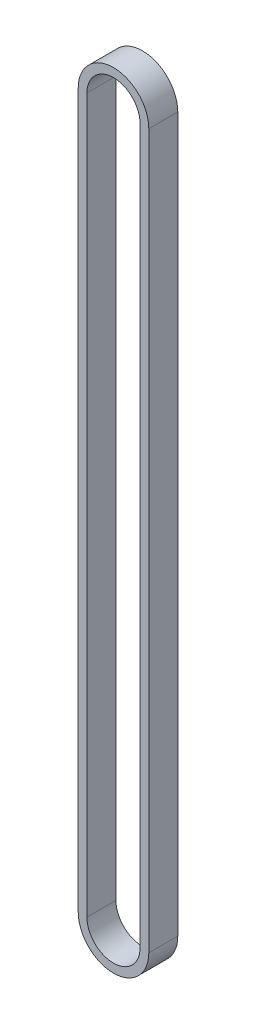
ISO-10303-21;
HEADER;
FILE_DESCRIPTION(('STEP AP214'),'2;1');
FILE_NAME('part.step','',(''),(''),'','','');
FILE_SCHEMA(('AUTOMOTIVE_DESIGN { 1 0 10303 214 1 1 1 1 }'));
ENDSEC;
DATA;
#1=APPLICATION_CONTEXT('core data for automotive mechanical design processes');
#2=APPLICATION_PROTOCOL_DEFINITION('international standard','automotive_design',2000,#1);
#3=PRODUCT_CONTEXT('',#1,'mechanical');
#4=PRODUCT('Part','Part','',(#3));
#5=PRODUCT_RELATED_PRODUCT_CATEGORY('part','',(#4));
#6=PRODUCT_DEFINITION_FORMATION('','',#4);
#7=PRODUCT_DEFINITION_CONTEXT('part definition',#1,'design');
#8=PRODUCT_DEFINITION('design','',#6,#7);
#9=PRODUCT_DEFINITION_SHAPE('','',#8);
#10=(LENGTH_UNIT() NAMED_UNIT(*) SI_UNIT(.MILLI.,.METRE.));
#11=(NAMED_UNIT(*) PLANE_ANGLE_UNIT() SI_UNIT($,.RADIAN.));
#12=(NAMED_UNIT(*) SI_UNIT($,.STERADIAN.) SOLID_ANGLE_UNIT());
#13=UNCERTAINTY_MEASURE_WITH_UNIT(LENGTH_MEASURE(1.E-05),#10,'distance_accuracy_value','');
#14=(GEOMETRIC_REPRESENTATION_CONTEXT(3) GLOBAL_UNCERTAINTY_ASSIGNED_CONTEXT((#13)) GLOBAL_UNIT_ASSIGNED_CONTEXT((#10,
#11,#12)) REPRESENTATION_CONTEXT('',''));
#15=CARTESIAN_POINT('',(0.,0.,0.));
#16=DIRECTION('',(0.,0.,1.));
#17=DIRECTION('',(1.,0.,0.));
#18=AXIS2_PLACEMENT_3D('',#15,#16,#17);
#19=CARTESIAN_POINT('',(0.,-123.1,10.));
#20=DIRECTION('',(0.,0.,1.));
#21=DIRECTION('',(1.,0.,0.));
#22=AXIS2_PLACEMENT_3D('',#19,#20,#21);
#23=PLANE('',#22);
#24=CARTESIAN_POINT('',(0.,-123.1,10.));
#25=DIRECTION('',(0.,0.,1.));
#26=DIRECTION('',(1.,0.,0.));
#27=AXIS2_PLACEMENT_3D('',#24,#25,#26);
#28=CIRCLE('',#27,12.17);
#29=CARTESIAN_POINT('',(-12.17,-123.1,10.));
#30=VERTEX_POINT('',#29);
#31=CARTESIAN_POINT('',(12.17,-123.1,10.));
#32=VERTEX_POINT('',#31);
#33=EDGE_CURVE('E156',#30,#32,#28,.T.);
#34=ORIENTED_EDGE('',*,*,#33,.T.);
#35=DIRECTION('',(0.,1.,0.));
#36=VECTOR('',#35,1.);
#37=CARTESIAN_POINT('',(12.17,-123.1,10.));
#38=LINE('',#37,#36);
#39=CARTESIAN_POINT('',(12.17,123.1,10.));
#40=VERTEX_POINT('',#39);
#41=EDGE_CURVE('E160',#32,#40,#38,.T.);
#42=ORIENTED_EDGE('',*,*,#41,.T.);
#43=CARTESIAN_POINT('',(0.,123.1,10.));
#44=DIRECTION('',(0.,0.,1.));
#45=DIRECTION('',(1.,0.,0.));
#46=AXIS2_PLACEMENT_3D('',#43,#44,#45);
#47=CIRCLE('',#46,12.17);
#48=CARTESIAN_POINT('',(-12.17,123.1,10.));
#49=VERTEX_POINT('',#48);
#50=EDGE_CURVE('E164',#40,#49,#47,.T.);
#51=ORIENTED_EDGE('',*,*,#50,.T.);
#52=DIRECTION('',(0.,-1.,0.));
#53=VECTOR('',#52,1.);
#54=CARTESIAN_POINT('',(-12.17,-123.1,10.));
#55=LINE('',#54,#53);
#56=EDGE_CURVE('E167',#49,#30,#55,.T.);
#57=ORIENTED_EDGE('',*,*,#56,.T.);
#58=EDGE_LOOP('',(#34,#42,#51,#57));
#59=FACE_BOUND('',#58,.T.);
#60=DIRECTION('',(0.,1.,0.));
#61=VECTOR('',#60,1.);
#62=CARTESIAN_POINT('',(9.17000000000005,-123.1,10.));
#63=LINE('',#62,#61);
#64=CARTESIAN_POINT('',(9.17000000000005,-123.1,10.));
#65=VERTEX_POINT('',#64);
#66=CARTESIAN_POINT('',(9.17,123.1,10.));
#67=VERTEX_POINT('',#66);
#68=EDGE_CURVE('E117',#65,#67,#63,.T.);
#69=ORIENTED_EDGE('',*,*,#68,.F.);
#70=CARTESIAN_POINT('',(0.,-123.1,10.));
#71=DIRECTION('',(0.,0.,1.));
#72=DIRECTION('',(1.,0.,0.));
#73=AXIS2_PLACEMENT_3D('',#70,#71,#72);
#74=CIRCLE('',#73,9.17000000000005);
#75=CARTESIAN_POINT('',(-9.17000000000005,-123.1,10.));
#76=VERTEX_POINT('',#75);
#77=EDGE_CURVE('E108',#76,#65,#74,.T.);
#78=ORIENTED_EDGE('',*,*,#77,.F.);
#79=DIRECTION('',(0.,-1.,0.));
#80=VECTOR('',#79,1.);
#81=CARTESIAN_POINT('',(-9.17000000000005,-123.1,10.));
#82=LINE('',#81,#80);
#83=CARTESIAN_POINT('',(-9.17000000000009,123.1,10.));
#84=VERTEX_POINT('',#83);
#85=EDGE_CURVE('E134',#84,#76,#82,.T.);
#86=ORIENTED_EDGE('',*,*,#85,.F.);
#87=CARTESIAN_POINT('',(0.,123.1,10.));
#88=DIRECTION('',(0.,0.,1.));
#89=DIRECTION('',(1.,0.,0.));
#90=AXIS2_PLACEMENT_3D('',#87,#88,#89);
#91=CIRCLE('',#90,9.17000000000005);
#92=EDGE_CURVE('E130',#67,#84,#91,.T.);
#93=ORIENTED_EDGE('',*,*,#92,.F.);
#94=EDGE_LOOP('',(#69,#78,#86,#93));
#95=FACE_BOUND('',#94,.T.);
#96=ADVANCED_FACE('F42',(#59,#95),#23,.T.);
#97=CARTESIAN_POINT('',(0.,-123.1,0.));
#98=DIRECTION('',(0.,0.,1.));
#99=DIRECTION('',(1.,0.,0.));
#100=AXIS2_PLACEMENT_3D('',#97,#98,#99);
#101=PLANE('',#100);
#102=CARTESIAN_POINT('',(0.,-123.1,0.));
#103=DIRECTION('',(0.,0.,1.));
#104=DIRECTION('',(1.,0.,0.));
#105=AXIS2_PLACEMENT_3D('',#102,#103,#104);
#106=CIRCLE('',#105,12.17);
#107=CARTESIAN_POINT('',(-12.17,-123.1,0.));
#108=VERTEX_POINT('',#107);
#109=CARTESIAN_POINT('',(12.17,-123.1,0.));
#110=VERTEX_POINT('',#109);
#111=EDGE_CURVE('E126',#108,#110,#106,.T.);
#112=ORIENTED_EDGE('',*,*,#111,.F.);
#113=DIRECTION('',(0.,-1.,0.));
#114=VECTOR('',#113,1.);
#115=CARTESIAN_POINT('',(-12.17,-123.1,0.));
#116=LINE('',#115,#114);
#117=CARTESIAN_POINT('',(-12.17,123.1,0.));
#118=VERTEX_POINT('',#117);
#119=EDGE_CURVE('E161',#118,#108,#116,.T.);
#120=ORIENTED_EDGE('',*,*,#119,.F.);
#121=CARTESIAN_POINT('',(0.,123.1,0.));
#122=DIRECTION('',(0.,0.,1.));
#123=DIRECTION('',(1.,0.,0.));
#124=AXIS2_PLACEMENT_3D('',#121,#122,#123);
#125=CIRCLE('',#124,12.17);
#126=CARTESIAN_POINT('',(12.17,123.1,0.));
#127=VERTEX_POINT('',#126);
#128=EDGE_CURVE('E177',#127,#118,#125,.T.);
#129=ORIENTED_EDGE('',*,*,#128,.F.);
#130=DIRECTION('',(0.,1.,0.));
#131=VECTOR('',#130,1.);
#132=CARTESIAN_POINT('',(12.17,-123.1,0.));
#133=LINE('',#132,#131);
#134=EDGE_CURVE('E174',#110,#127,#133,.T.);
#135=ORIENTED_EDGE('',*,*,#134,.F.);
#136=EDGE_LOOP('',(#112,#120,#129,#135));
#137=FACE_BOUND('',#136,.T.);
#138=CARTESIAN_POINT('',(0.,-123.1,0.));
#139=DIRECTION('',(0.,0.,1.));
#140=DIRECTION('',(1.,0.,0.));
#141=AXIS2_PLACEMENT_3D('',#138,#139,#140);
#142=CIRCLE('',#141,9.17000000000005);
#143=CARTESIAN_POINT('',(-9.17000000000005,-123.1,0.));
#144=VERTEX_POINT('',#143);
#145=CARTESIAN_POINT('',(9.17000000000005,-123.1,0.));
#146=VERTEX_POINT('',#145);
#147=EDGE_CURVE('E66',#144,#146,#142,.T.);
#148=ORIENTED_EDGE('',*,*,#147,.T.);
#149=DIRECTION('',(0.,1.,0.));
#150=VECTOR('',#149,1.);
#151=CARTESIAN_POINT('',(9.17000000000005,-123.1,0.));
#152=LINE('',#151,#150);
#153=CARTESIAN_POINT('',(9.17,123.1,0.));
#154=VERTEX_POINT('',#153);
#155=EDGE_CURVE('E124',#146,#154,#152,.T.);
#156=ORIENTED_EDGE('',*,*,#155,.T.);
#157=CARTESIAN_POINT('',(0.,123.1,0.));
#158=DIRECTION('',(0.,0.,1.));
#159=DIRECTION('',(1.,0.,0.));
#160=AXIS2_PLACEMENT_3D('',#157,#158,#159);
#161=CIRCLE('',#160,9.17000000000005);
#162=CARTESIAN_POINT('',(-9.17000000000009,123.1,0.));
#163=VERTEX_POINT('',#162);
#164=EDGE_CURVE('E143',#154,#163,#161,.T.);
#165=ORIENTED_EDGE('',*,*,#164,.T.);
#166=DIRECTION('',(0.,-1.,0.));
#167=VECTOR('',#166,1.);
#168=CARTESIAN_POINT('',(-9.17000000000005,-123.1,0.));
#169=LINE('',#168,#167);
#170=EDGE_CURVE('E118',#163,#144,#169,.T.);
#171=ORIENTED_EDGE('',*,*,#170,.T.);
#172=EDGE_LOOP('',(#148,#156,#165,#171));
#173=FACE_BOUND('',#172,.T.);
#174=ADVANCED_FACE('F200',(#137,#173),#101,.F.);
#175=CARTESIAN_POINT('',(0.,-123.1,10.));
#176=DIRECTION('',(0.,0.,-1.));
#177=DIRECTION('',(-1.,0.,0.));
#178=AXIS2_PLACEMENT_3D('',#175,#176,#177);
#179=CYLINDRICAL_SURFACE('',#178,12.17);
#180=ORIENTED_EDGE('',*,*,#111,.T.);
#181=DIRECTION('',(0.,0.,-1.));
#182=VECTOR('',#181,1.);
#183=CARTESIAN_POINT('',(12.17,-123.1,10.));
#184=LINE('',#183,#182);
#185=EDGE_CURVE('E11',#32,#110,#184,.T.);
#186=ORIENTED_EDGE('',*,*,#185,.F.);
#187=ORIENTED_EDGE('',*,*,#33,.F.);
#188=DIRECTION('',(0.,0.,-1.));
#189=VECTOR('',#188,1.);
#190=CARTESIAN_POINT('',(-12.17,-123.1,10.));
#191=LINE('',#190,#189);
#192=EDGE_CURVE('E170',#30,#108,#191,.T.);
#193=ORIENTED_EDGE('',*,*,#192,.T.);
#194=EDGE_LOOP('',(#180,#186,#187,#193));
#195=FACE_BOUND('',#194,.T.);
#196=ADVANCED_FACE('F44',(#195),#179,.T.);
#197=CARTESIAN_POINT('',(12.17,-123.1,10.));
#198=DIRECTION('',(-1.,0.,0.));
#199=DIRECTION('',(0.,-1.,0.));
#200=AXIS2_PLACEMENT_3D('',#197,#198,#199);
#201=PLANE('',#200);
#202=ORIENTED_EDGE('',*,*,#134,.T.);
#203=DIRECTION('',(0.,0.,-1.));
#204=VECTOR('',#203,1.);
#205=CARTESIAN_POINT('',(12.17,123.1,10.));
#206=LINE('',#205,#204);
#207=EDGE_CURVE('E51',#40,#127,#206,.T.);
#208=ORIENTED_EDGE('',*,*,#207,.F.);
#209=ORIENTED_EDGE('',*,*,#41,.F.);
#210=ORIENTED_EDGE('',*,*,#185,.T.);
#211=EDGE_LOOP('',(#202,#208,#209,#210));
#212=FACE_BOUND('',#211,.T.);
#213=ADVANCED_FACE('F210',(#212),#201,.F.);
#214=CARTESIAN_POINT('',(0.,123.1,10.));
#215=DIRECTION('',(0.,0.,-1.));
#216=DIRECTION('',(-1.,0.,0.));
#217=AXIS2_PLACEMENT_3D('',#214,#215,#216);
#218=CYLINDRICAL_SURFACE('',#217,12.17);
#219=ORIENTED_EDGE('',*,*,#128,.T.);
#220=DIRECTION('',(0.,0.,-1.));
#221=VECTOR('',#220,1.);
#222=CARTESIAN_POINT('',(-12.17,123.1,10.));
#223=LINE('',#222,#221);
#224=EDGE_CURVE('E185',#49,#118,#223,.T.);
#225=ORIENTED_EDGE('',*,*,#224,.F.);
#226=ORIENTED_EDGE('',*,*,#50,.F.);
#227=ORIENTED_EDGE('',*,*,#207,.T.);
#228=EDGE_LOOP('',(#219,#225,#226,#227));
#229=FACE_BOUND('',#228,.T.);
#230=ADVANCED_FACE('F194',(#229),#218,.T.);
#231=CARTESIAN_POINT('',(-12.17,-123.1,10.));
#232=DIRECTION('',(1.,0.,0.));
#233=DIRECTION('',(0.,0.,-1.));
#234=AXIS2_PLACEMENT_3D('',#231,#232,#233);
#235=PLANE('',#234);
#236=ORIENTED_EDGE('',*,*,#119,.T.);
#237=ORIENTED_EDGE('',*,*,#192,.F.);
#238=ORIENTED_EDGE('',*,*,#56,.F.);
#239=ORIENTED_EDGE('',*,*,#224,.T.);
#240=EDGE_LOOP('',(#236,#237,#238,#239));
#241=FACE_BOUND('',#240,.T.);
#242=ADVANCED_FACE('F204',(#241),#235,.F.);
#243=CARTESIAN_POINT('',(0.,-123.1,10.));
#244=DIRECTION('',(0.,0.,-1.));
#245=DIRECTION('',(-1.,0.,0.));
#246=AXIS2_PLACEMENT_3D('',#243,#244,#245);
#247=CYLINDRICAL_SURFACE('',#246,9.17000000000005);
#248=ORIENTED_EDGE('',*,*,#147,.F.);
#249=DIRECTION('',(0.,0.,-1.));
#250=VECTOR('',#249,1.);
#251=CARTESIAN_POINT('',(-9.17000000000005,-123.1,10.));
#252=LINE('',#251,#250);
#253=EDGE_CURVE('E112',#76,#144,#252,.T.);
#254=ORIENTED_EDGE('',*,*,#253,.F.);
#255=ORIENTED_EDGE('',*,*,#77,.T.);
#256=DIRECTION('',(0.,0.,-1.));
#257=VECTOR('',#256,1.);
#258=CARTESIAN_POINT('',(9.17000000000005,-123.1,10.));
#259=LINE('',#258,#257);
#260=EDGE_CURVE('E111',#65,#146,#259,.T.);
#261=ORIENTED_EDGE('',*,*,#260,.T.);
#262=EDGE_LOOP('',(#248,#254,#255,#261));
#263=FACE_BOUND('',#262,.T.);
#264=ADVANCED_FACE('F110',(#263),#247,.F.);
#265=CARTESIAN_POINT('',(9.17000000000005,-123.1,10.));
#266=DIRECTION('',(-1.,0.,0.));
#267=DIRECTION('',(0.,-1.,0.));
#268=AXIS2_PLACEMENT_3D('',#265,#266,#267);
#269=PLANE('',#268);
#270=ORIENTED_EDGE('',*,*,#155,.F.);
#271=ORIENTED_EDGE('',*,*,#260,.F.);
#272=ORIENTED_EDGE('',*,*,#68,.T.);
#273=DIRECTION('',(0.,0.,-1.));
#274=VECTOR('',#273,1.);
#275=CARTESIAN_POINT('',(9.17,123.1,10.));
#276=LINE('',#275,#274);
#277=EDGE_CURVE('E127',#67,#154,#276,.T.);
#278=ORIENTED_EDGE('',*,*,#277,.T.);
#279=EDGE_LOOP('',(#270,#271,#272,#278));
#280=FACE_BOUND('',#279,.T.);
#281=ADVANCED_FACE('F121',(#280),#269,.T.);
#282=CARTESIAN_POINT('',(0.,123.1,10.));
#283=DIRECTION('',(0.,0.,-1.));
#284=DIRECTION('',(-1.,0.,0.));
#285=AXIS2_PLACEMENT_3D('',#282,#283,#284);
#286=CYLINDRICAL_SURFACE('',#285,9.17000000000005);
#287=ORIENTED_EDGE('',*,*,#164,.F.);
#288=ORIENTED_EDGE('',*,*,#277,.F.);
#289=ORIENTED_EDGE('',*,*,#92,.T.);
#290=DIRECTION('',(0.,0.,-1.));
#291=VECTOR('',#290,1.);
#292=CARTESIAN_POINT('',(-9.17000000000009,123.1,10.));
#293=LINE('',#292,#291);
#294=EDGE_CURVE('E58',#84,#163,#293,.T.);
#295=ORIENTED_EDGE('',*,*,#294,.T.);
#296=EDGE_LOOP('',(#287,#288,#289,#295));
#297=FACE_BOUND('',#296,.T.);
#298=ADVANCED_FACE('F233',(#297),#286,.F.);
#299=CARTESIAN_POINT('',(-9.17000000000005,-123.1,10.));
#300=DIRECTION('',(1.,0.,0.));
#301=DIRECTION('',(0.,1.,0.));
#302=AXIS2_PLACEMENT_3D('',#299,#300,#301);
#303=PLANE('',#302);
#304=ORIENTED_EDGE('',*,*,#170,.F.);
#305=ORIENTED_EDGE('',*,*,#294,.F.);
#306=ORIENTED_EDGE('',*,*,#85,.T.);
#307=ORIENTED_EDGE('',*,*,#253,.T.);
#308=EDGE_LOOP('',(#304,#305,#306,#307));
#309=FACE_BOUND('',#308,.T.);
#310=ADVANCED_FACE('F237',(#309),#303,.T.);
#311=CLOSED_SHELL('',(#96,#174,#196,#213,#230,#242,#264,#281,#298,#310));
#312=MANIFOLD_SOLID_BREP('B2',#311);
#313=ADVANCED_BREP_SHAPE_REPRESENTATION('',(#18,#312),#14);
#314=SHAPE_DEFINITION_REPRESENTATION(#9,#313);
ENDSEC;
END-ISO-10303-21;
